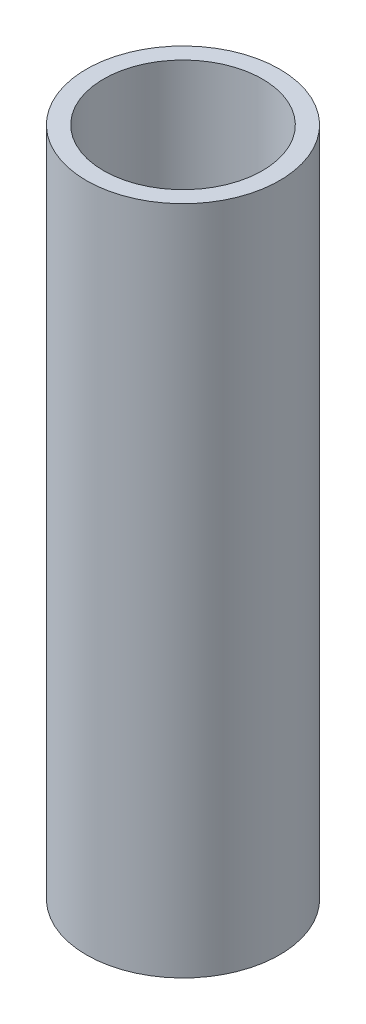
ISO-10303-21;
HEADER;
FILE_DESCRIPTION(('STEP AP214'),'2;1');
FILE_NAME('part.step','',(''),(''),'','','');
FILE_SCHEMA(('AUTOMOTIVE_DESIGN { 1 0 10303 214 1 1 1 1 }'));
ENDSEC;
DATA;
#1=APPLICATION_CONTEXT('core data for automotive mechanical design processes');
#2=APPLICATION_PROTOCOL_DEFINITION('international standard','automotive_design',2000,#1);
#3=PRODUCT_CONTEXT('',#1,'mechanical');
#4=PRODUCT('Part','Part','',(#3));
#5=PRODUCT_RELATED_PRODUCT_CATEGORY('part','',(#4));
#6=PRODUCT_DEFINITION_FORMATION('','',#4);
#7=PRODUCT_DEFINITION_CONTEXT('part definition',#1,'design');
#8=PRODUCT_DEFINITION('design','',#6,#7);
#9=PRODUCT_DEFINITION_SHAPE('','',#8);
#10=(LENGTH_UNIT() NAMED_UNIT(*) SI_UNIT(.MILLI.,.METRE.));
#11=(NAMED_UNIT(*) PLANE_ANGLE_UNIT() SI_UNIT($,.RADIAN.));
#12=(NAMED_UNIT(*) SI_UNIT($,.STERADIAN.) SOLID_ANGLE_UNIT());
#13=UNCERTAINTY_MEASURE_WITH_UNIT(LENGTH_MEASURE(1.E-05),#10,'distance_accuracy_value','');
#14=(GEOMETRIC_REPRESENTATION_CONTEXT(3) GLOBAL_UNCERTAINTY_ASSIGNED_CONTEXT((#13)) GLOBAL_UNIT_ASSIGNED_CONTEXT((#10,
#11,#12)) REPRESENTATION_CONTEXT('',''));
#15=CARTESIAN_POINT('',(0.,0.,0.));
#16=DIRECTION('',(0.,0.,1.));
#17=DIRECTION('',(1.,0.,0.));
#18=AXIS2_PLACEMENT_3D('',#15,#16,#17);
#19=CARTESIAN_POINT('',(0.,67.,0.));
#20=DIRECTION('',(0.,1.,0.));
#21=DIRECTION('',(0.,0.,1.));
#22=AXIS2_PLACEMENT_3D('',#19,#20,#21);
#23=PLANE('',#22);
#24=CARTESIAN_POINT('',(0.,67.,0.));
#25=DIRECTION('',(0.,1.,0.));
#26=DIRECTION('',(0.,0.,1.));
#27=AXIS2_PLACEMENT_3D('',#24,#25,#26);
#28=CIRCLE('',#27,9.652);
#29=CARTESIAN_POINT('',(0.,67.,9.652));
#30=VERTEX_POINT('',#29);
#31=EDGE_CURVE('E10',#30,#30,#28,.T.);
#32=ORIENTED_EDGE('',*,*,#31,.T.);
#33=EDGE_LOOP('',(#32));
#34=FACE_BOUND('',#33,.T.);
#35=CARTESIAN_POINT('',(0.,67.,0.));
#36=DIRECTION('',(0.,1.,0.));
#37=DIRECTION('',(0.,0.,1.));
#38=AXIS2_PLACEMENT_3D('',#35,#36,#37);
#39=CIRCLE('',#38,7.9375);
#40=CARTESIAN_POINT('',(0.,67.,7.9375));
#41=VERTEX_POINT('',#40);
#42=EDGE_CURVE('E41',#41,#41,#39,.T.);
#43=ORIENTED_EDGE('',*,*,#42,.F.);
#44=EDGE_LOOP('',(#43));
#45=FACE_BOUND('',#44,.T.);
#46=ADVANCED_FACE('F30',(#34,#45),#23,.T.);
#47=CARTESIAN_POINT('',(0.,0.,0.));
#48=DIRECTION('',(0.,1.,0.));
#49=DIRECTION('',(0.,0.,1.));
#50=AXIS2_PLACEMENT_3D('',#47,#48,#49);
#51=PLANE('',#50);
#52=CARTESIAN_POINT('',(0.,0.,0.));
#53=DIRECTION('',(0.,1.,0.));
#54=DIRECTION('',(0.,0.,1.));
#55=AXIS2_PLACEMENT_3D('',#52,#53,#54);
#56=CIRCLE('',#55,9.652);
#57=CARTESIAN_POINT('',(0.,0.,9.652));
#58=VERTEX_POINT('',#57);
#59=EDGE_CURVE('E34',#58,#58,#56,.T.);
#60=ORIENTED_EDGE('',*,*,#59,.F.);
#61=EDGE_LOOP('',(#60));
#62=FACE_BOUND('',#61,.T.);
#63=CARTESIAN_POINT('',(0.,0.,0.));
#64=DIRECTION('',(0.,1.,0.));
#65=DIRECTION('',(0.,0.,1.));
#66=AXIS2_PLACEMENT_3D('',#63,#64,#65);
#67=CIRCLE('',#66,7.9375);
#68=CARTESIAN_POINT('',(0.,0.,7.9375));
#69=VERTEX_POINT('',#68);
#70=EDGE_CURVE('E43',#69,#69,#67,.T.);
#71=ORIENTED_EDGE('',*,*,#70,.T.);
#72=EDGE_LOOP('',(#71));
#73=FACE_BOUND('',#72,.T.);
#74=ADVANCED_FACE('F53',(#62,#73),#51,.F.);
#75=CARTESIAN_POINT('',(0.,67.,0.));
#76=DIRECTION('',(0.,-1.,0.));
#77=DIRECTION('',(0.,0.,-1.));
#78=AXIS2_PLACEMENT_3D('',#75,#76,#77);
#79=CYLINDRICAL_SURFACE('',#78,9.652);
#80=ORIENTED_EDGE('',*,*,#31,.F.);
#81=EDGE_LOOP('',(#80));
#82=FACE_BOUND('',#81,.T.);
#83=ORIENTED_EDGE('',*,*,#59,.T.);
#84=EDGE_LOOP('',(#83));
#85=FACE_BOUND('',#84,.T.);
#86=ADVANCED_FACE('F32',(#82,#85),#79,.T.);
#87=CARTESIAN_POINT('',(0.,67.,0.));
#88=DIRECTION('',(0.,-1.,0.));
#89=DIRECTION('',(0.,0.,-1.));
#90=AXIS2_PLACEMENT_3D('',#87,#88,#89);
#91=CYLINDRICAL_SURFACE('',#90,7.9375);
#92=ORIENTED_EDGE('',*,*,#42,.T.);
#93=EDGE_LOOP('',(#92));
#94=FACE_BOUND('',#93,.T.);
#95=ORIENTED_EDGE('',*,*,#70,.F.);
#96=EDGE_LOOP('',(#95));
#97=FACE_BOUND('',#96,.T.);
#98=ADVANCED_FACE('F49',(#94,#97),#91,.F.);
#99=CLOSED_SHELL('',(#46,#74,#86,#98));
#100=MANIFOLD_SOLID_BREP('B2',#99);
#101=ADVANCED_BREP_SHAPE_REPRESENTATION('',(#18,#100),#14);
#102=SHAPE_DEFINITION_REPRESENTATION(#9,#101);
ENDSEC;
END-ISO-10303-21;
